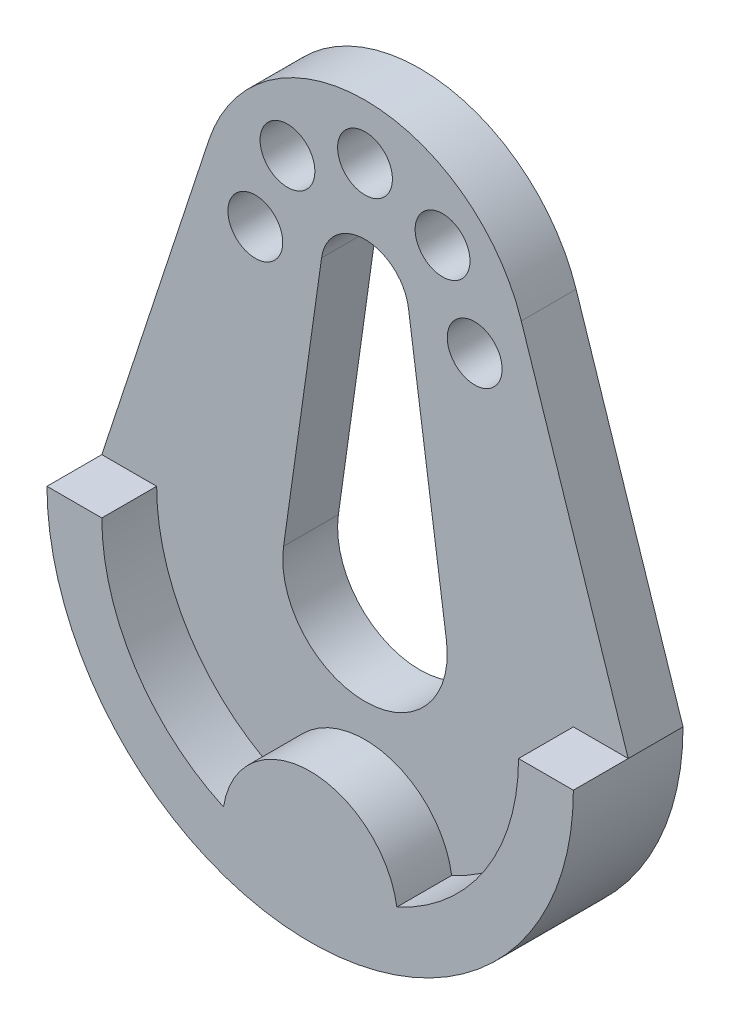
ISO-10303-21;
HEADER;
FILE_DESCRIPTION(('STEP AP214'),'2;1');
FILE_NAME('part.step','',(''),(''),'','','');
FILE_SCHEMA(('AUTOMOTIVE_DESIGN { 1 0 10303 214 1 1 1 1 }'));
ENDSEC;
DATA;
#1=APPLICATION_CONTEXT('core data for automotive mechanical design processes');
#2=APPLICATION_PROTOCOL_DEFINITION('international standard','automotive_design',2000,#1);
#3=PRODUCT_CONTEXT('',#1,'mechanical');
#4=PRODUCT('Part','Part','',(#3));
#5=PRODUCT_RELATED_PRODUCT_CATEGORY('part','',(#4));
#6=PRODUCT_DEFINITION_FORMATION('','',#4);
#7=PRODUCT_DEFINITION_CONTEXT('part definition',#1,'design');
#8=PRODUCT_DEFINITION('design','',#6,#7);
#9=PRODUCT_DEFINITION_SHAPE('','',#8);
#10=(LENGTH_UNIT() NAMED_UNIT(*) SI_UNIT(.MILLI.,.METRE.));
#11=(NAMED_UNIT(*) PLANE_ANGLE_UNIT() SI_UNIT($,.RADIAN.));
#12=(NAMED_UNIT(*) SI_UNIT($,.STERADIAN.) SOLID_ANGLE_UNIT());
#13=UNCERTAINTY_MEASURE_WITH_UNIT(LENGTH_MEASURE(1.E-05),#10,'distance_accuracy_value','');
#14=(GEOMETRIC_REPRESENTATION_CONTEXT(3) GLOBAL_UNCERTAINTY_ASSIGNED_CONTEXT((#13)) GLOBAL_UNIT_ASSIGNED_CONTEXT((#10,
#11,#12)) REPRESENTATION_CONTEXT('',''));
#15=CARTESIAN_POINT('',(0.,0.,0.));
#16=DIRECTION('',(0.,0.,1.));
#17=DIRECTION('',(1.,0.,0.));
#18=AXIS2_PLACEMENT_3D('',#15,#16,#17);
#19=CARTESIAN_POINT('',(43.3256929799226,14.2308675366532,10.));
#20=DIRECTION('',(-0.950062420974742,-0.312059924135753,0.));
#21=DIRECTION('',(0.312059924135753,-0.950062420974742,0.));
#22=AXIS2_PLACEMENT_3D('',#19,#20,#21);
#23=PLANE('',#22);
#24=DIRECTION('',(-0.312059924135753,0.950062420974742,0.));
#25=VECTOR('',#24,1.);
#26=CARTESIAN_POINT('',(43.3256929799226,14.2308675366532,0.));
#27=LINE('',#26,#25);
#28=CARTESIAN_POINT('',(48.,0.,0.));
#29=VERTEX_POINT('',#28);
#30=CARTESIAN_POINT('',(28.5018726292423,59.3617977240726,0.));
#31=VERTEX_POINT('',#30);
#32=EDGE_CURVE('E235',#29,#31,#27,.T.);
#33=ORIENTED_EDGE('',*,*,#32,.T.);
#34=DIRECTION('',(0.,0.,-1.));
#35=VECTOR('',#34,1.);
#36=CARTESIAN_POINT('',(28.5018726292423,59.3617977240726,10.));
#37=LINE('',#36,#35);
#38=CARTESIAN_POINT('',(28.5018726292423,59.3617977240726,10.));
#39=VERTEX_POINT('',#38);
#40=EDGE_CURVE('E47',#39,#31,#37,.T.);
#41=ORIENTED_EDGE('',*,*,#40,.F.);
#42=DIRECTION('',(-0.312059924135753,0.950062420974742,0.));
#43=VECTOR('',#42,1.);
#44=CARTESIAN_POINT('',(43.3256929799226,14.2308675366532,10.));
#45=LINE('',#44,#43);
#46=CARTESIAN_POINT('',(48.,0.,10.));
#47=VERTEX_POINT('',#46);
#48=EDGE_CURVE('E204',#47,#39,#45,.T.);
#49=ORIENTED_EDGE('',*,*,#48,.F.);
#50=DIRECTION('',(0.,0.,-1.));
#51=VECTOR('',#50,1.);
#52=CARTESIAN_POINT('',(48.,0.,10.));
#53=LINE('',#52,#51);
#54=EDGE_CURVE('E11',#47,#29,#53,.T.);
#55=ORIENTED_EDGE('',*,*,#54,.T.);
#56=EDGE_LOOP('',(#33,#41,#49,#55));
#57=FACE_BOUND('',#56,.T.);
#58=ADVANCED_FACE('F37',(#57),#23,.F.);
#59=CARTESIAN_POINT('',(0.,50.,10.));
#60=DIRECTION('',(0.,0.,-1.));
#61=DIRECTION('',(-1.,0.,0.));
#62=AXIS2_PLACEMENT_3D('',#59,#60,#61);
#63=CYLINDRICAL_SURFACE('',#62,30.);
#64=CARTESIAN_POINT('',(0.,50.,0.));
#65=DIRECTION('',(0.,0.,1.));
#66=DIRECTION('',(1.,0.,0.));
#67=AXIS2_PLACEMENT_3D('',#64,#65,#66);
#68=CIRCLE('',#67,30.);
#69=CARTESIAN_POINT('',(-28.5018726292423,59.3617977240726,0.));
#70=VERTEX_POINT('',#69);
#71=EDGE_CURVE('E83',#31,#70,#68,.T.);
#72=ORIENTED_EDGE('',*,*,#71,.T.);
#73=DIRECTION('',(0.,0.,-1.));
#74=VECTOR('',#73,1.);
#75=CARTESIAN_POINT('',(-28.5018726292423,59.3617977240726,10.));
#76=LINE('',#75,#74);
#77=CARTESIAN_POINT('',(-28.5018726292423,59.3617977240726,10.));
#78=VERTEX_POINT('',#77);
#79=EDGE_CURVE('E139',#78,#70,#76,.T.);
#80=ORIENTED_EDGE('',*,*,#79,.F.);
#81=CARTESIAN_POINT('',(0.,50.,10.));
#82=DIRECTION('',(0.,0.,1.));
#83=DIRECTION('',(1.,0.,0.));
#84=AXIS2_PLACEMENT_3D('',#81,#82,#83);
#85=CIRCLE('',#84,30.);
#86=EDGE_CURVE('E131',#39,#78,#85,.T.);
#87=ORIENTED_EDGE('',*,*,#86,.F.);
#88=ORIENTED_EDGE('',*,*,#40,.T.);
#89=EDGE_LOOP('',(#72,#80,#87,#88));
#90=FACE_BOUND('',#89,.T.);
#91=ADVANCED_FACE('F274',(#90),#63,.T.);
#92=CARTESIAN_POINT('',(-43.3256929799227,14.2308675366532,10.));
#93=DIRECTION('',(0.950062420974742,-0.312059924135752,0.));
#94=DIRECTION('',(0.312059924135752,0.950062420974742,0.));
#95=AXIS2_PLACEMENT_3D('',#92,#93,#94);
#96=PLANE('',#95);
#97=DIRECTION('',(-0.312059924135752,-0.950062420974742,0.));
#98=VECTOR('',#97,1.);
#99=CARTESIAN_POINT('',(-43.3256929799227,14.2308675366532,0.));
#100=LINE('',#99,#98);
#101=CARTESIAN_POINT('',(-48.,0.,0.));
#102=VERTEX_POINT('',#101);
#103=EDGE_CURVE('E90',#70,#102,#100,.T.);
#104=ORIENTED_EDGE('',*,*,#103,.T.);
#105=DIRECTION('',(0.,0.,-1.));
#106=VECTOR('',#105,1.);
#107=CARTESIAN_POINT('',(-48.,0.,10.));
#108=LINE('',#107,#106);
#109=CARTESIAN_POINT('',(-48.,0.,10.));
#110=VERTEX_POINT('',#109);
#111=EDGE_CURVE('E133',#110,#102,#108,.T.);
#112=ORIENTED_EDGE('',*,*,#111,.F.);
#113=DIRECTION('',(-0.312059924135752,-0.950062420974742,0.));
#114=VECTOR('',#113,1.);
#115=CARTESIAN_POINT('',(-43.3256929799227,14.2308675366532,10.));
#116=LINE('',#115,#114);
#117=EDGE_CURVE('E126',#78,#110,#116,.T.);
#118=ORIENTED_EDGE('',*,*,#117,.F.);
#119=ORIENTED_EDGE('',*,*,#79,.T.);
#120=EDGE_LOOP('',(#104,#112,#118,#119));
#121=FACE_BOUND('',#120,.T.);
#122=ADVANCED_FACE('F134',(#121),#96,.F.);
#123=CARTESIAN_POINT('',(0.,50.,10.));
#124=DIRECTION('',(0.,0.,-1.));
#125=DIRECTION('',(-1.,0.,0.));
#126=AXIS2_PLACEMENT_3D('',#123,#124,#125);
#127=CYLINDRICAL_SURFACE('',#126,8.);
#128=CARTESIAN_POINT('',(0.,50.,0.));
#129=DIRECTION('',(0.,0.,1.));
#130=DIRECTION('',(1.,0.,0.));
#131=AXIS2_PLACEMENT_3D('',#128,#129,#130);
#132=CIRCLE('',#131,8.);
#133=CARTESIAN_POINT('',(7.9212120284714,51.12,0.));
#134=VERTEX_POINT('',#133);
#135=CARTESIAN_POINT('',(-7.9212120284714,51.12,0.));
#136=VERTEX_POINT('',#135);
#137=EDGE_CURVE('E223',#134,#136,#132,.T.);
#138=ORIENTED_EDGE('',*,*,#137,.F.);
#139=DIRECTION('',(0.,0.,-1.));
#140=VECTOR('',#139,1.);
#141=CARTESIAN_POINT('',(7.9212120284714,51.12,10.));
#142=LINE('',#141,#140);
#143=CARTESIAN_POINT('',(7.9212120284714,51.12,10.));
#144=VERTEX_POINT('',#143);
#145=EDGE_CURVE('E41',#144,#134,#142,.T.);
#146=ORIENTED_EDGE('',*,*,#145,.F.);
#147=CARTESIAN_POINT('',(0.,50.,10.));
#148=DIRECTION('',(0.,0.,1.));
#149=DIRECTION('',(1.,0.,0.));
#150=AXIS2_PLACEMENT_3D('',#147,#148,#149);
#151=CIRCLE('',#150,8.);
#152=CARTESIAN_POINT('',(-7.9212120284714,51.12,10.));
#153=VERTEX_POINT('',#152);
#154=EDGE_CURVE('E187',#144,#153,#151,.T.);
#155=ORIENTED_EDGE('',*,*,#154,.T.);
#156=DIRECTION('',(0.,0.,-1.));
#157=VECTOR('',#156,1.);
#158=CARTESIAN_POINT('',(-7.9212120284714,51.12,10.));
#159=LINE('',#158,#157);
#160=EDGE_CURVE('E208',#153,#136,#159,.T.);
#161=ORIENTED_EDGE('',*,*,#160,.T.);
#162=EDGE_LOOP('',(#138,#146,#155,#161));
#163=FACE_BOUND('',#162,.T.);
#164=ADVANCED_FACE('F250',(#163),#127,.F.);
#165=CARTESIAN_POINT('',(14.8522725533839,2.1,10.));
#166=DIRECTION('',(-0.990151503558925,-0.14,0.));
#167=DIRECTION('',(0.14,-0.990151503558925,0.));
#168=AXIS2_PLACEMENT_3D('',#165,#166,#167);
#169=PLANE('',#168);
#170=DIRECTION('',(-0.14,0.990151503558925,0.));
#171=VECTOR('',#170,1.);
#172=CARTESIAN_POINT('',(14.8522725533839,2.1,0.));
#173=LINE('',#172,#171);
#174=CARTESIAN_POINT('',(14.8522725533839,2.1,0.));
#175=VERTEX_POINT('',#174);
#176=EDGE_CURVE('E226',#175,#134,#173,.T.);
#177=ORIENTED_EDGE('',*,*,#176,.F.);
#178=DIRECTION('',(0.,0.,-1.));
#179=VECTOR('',#178,1.);
#180=CARTESIAN_POINT('',(14.8522725533839,2.1,10.));
#181=LINE('',#180,#179);
#182=CARTESIAN_POINT('',(14.8522725533839,2.1,10.));
#183=VERTEX_POINT('',#182);
#184=EDGE_CURVE('E243',#183,#175,#181,.T.);
#185=ORIENTED_EDGE('',*,*,#184,.F.);
#186=DIRECTION('',(-0.14,0.990151503558925,0.));
#187=VECTOR('',#186,1.);
#188=CARTESIAN_POINT('',(14.8522725533839,2.1,10.));
#189=LINE('',#188,#187);
#190=EDGE_CURVE('E189',#183,#144,#189,.T.);
#191=ORIENTED_EDGE('',*,*,#190,.T.);
#192=ORIENTED_EDGE('',*,*,#145,.T.);
#193=EDGE_LOOP('',(#177,#185,#191,#192));
#194=FACE_BOUND('',#193,.T.);
#195=ADVANCED_FACE('F248',(#194),#169,.T.);
#196=CARTESIAN_POINT('',(0.,0.,10.));
#197=DIRECTION('',(0.,0.,-1.));
#198=DIRECTION('',(-1.,0.,0.));
#199=AXIS2_PLACEMENT_3D('',#196,#197,#198);
#200=CYLINDRICAL_SURFACE('',#199,15.);
#201=CARTESIAN_POINT('',(0.,0.,0.));
#202=DIRECTION('',(0.,0.,1.));
#203=DIRECTION('',(1.,0.,0.));
#204=AXIS2_PLACEMENT_3D('',#201,#202,#203);
#205=CIRCLE('',#204,15.);
#206=CARTESIAN_POINT('',(-14.8522725533839,2.1,0.));
#207=VERTEX_POINT('',#206);
#208=EDGE_CURVE('E229',#207,#175,#205,.T.);
#209=ORIENTED_EDGE('',*,*,#208,.F.);
#210=DIRECTION('',(0.,0.,-1.));
#211=VECTOR('',#210,1.);
#212=CARTESIAN_POINT('',(-14.8522725533839,2.1,10.));
#213=LINE('',#212,#211);
#214=CARTESIAN_POINT('',(-14.8522725533839,2.1,10.));
#215=VERTEX_POINT('',#214);
#216=EDGE_CURVE('E242',#215,#207,#213,.T.);
#217=ORIENTED_EDGE('',*,*,#216,.F.);
#218=CARTESIAN_POINT('',(0.,0.,10.));
#219=DIRECTION('',(0.,0.,1.));
#220=DIRECTION('',(1.,0.,0.));
#221=AXIS2_PLACEMENT_3D('',#218,#219,#220);
#222=CIRCLE('',#221,15.);
#223=EDGE_CURVE('E192',#215,#183,#222,.T.);
#224=ORIENTED_EDGE('',*,*,#223,.T.);
#225=ORIENTED_EDGE('',*,*,#184,.T.);
#226=EDGE_LOOP('',(#209,#217,#224,#225));
#227=FACE_BOUND('',#226,.T.);
#228=ADVANCED_FACE('F255',(#227),#200,.F.);
#229=CARTESIAN_POINT('',(-14.8522725533839,2.1,10.));
#230=DIRECTION('',(0.990151503558925,-0.14,0.));
#231=DIRECTION('',(0.14,0.990151503558925,0.));
#232=AXIS2_PLACEMENT_3D('',#229,#230,#231);
#233=PLANE('',#232);
#234=DIRECTION('',(-0.14,-0.990151503558925,0.));
#235=VECTOR('',#234,1.);
#236=CARTESIAN_POINT('',(-14.8522725533839,2.1,0.));
#237=LINE('',#236,#235);
#238=EDGE_CURVE('E232',#136,#207,#237,.T.);
#239=ORIENTED_EDGE('',*,*,#238,.F.);
#240=ORIENTED_EDGE('',*,*,#160,.F.);
#241=DIRECTION('',(-0.14,-0.990151503558925,0.));
#242=VECTOR('',#241,1.);
#243=CARTESIAN_POINT('',(-14.8522725533839,2.1,10.));
#244=LINE('',#243,#242);
#245=EDGE_CURVE('E195',#153,#215,#244,.T.);
#246=ORIENTED_EDGE('',*,*,#245,.T.);
#247=ORIENTED_EDGE('',*,*,#216,.T.);
#248=EDGE_LOOP('',(#239,#240,#246,#247));
#249=FACE_BOUND('',#248,.T.);
#250=ADVANCED_FACE('F260',(#249),#233,.T.);
#251=CARTESIAN_POINT('',(-20.,50.,10.));
#252=DIRECTION('',(0.,0.,-1.));
#253=DIRECTION('',(-1.,0.,0.));
#254=AXIS2_PLACEMENT_3D('',#251,#252,#253);
#255=CYLINDRICAL_SURFACE('',#254,5.);
#256=CARTESIAN_POINT('',(-20.,50.,10.));
#257=DIRECTION('',(0.,0.,1.));
#258=DIRECTION('',(1.,0.,0.));
#259=AXIS2_PLACEMENT_3D('',#256,#257,#258);
#260=CIRCLE('',#259,5.);
#261=CARTESIAN_POINT('',(-15.,50.,10.));
#262=VERTEX_POINT('',#261);
#263=EDGE_CURVE('E184',#262,#262,#260,.T.);
#264=ORIENTED_EDGE('',*,*,#263,.T.);
#265=EDGE_LOOP('',(#264));
#266=FACE_BOUND('',#265,.T.);
#267=CARTESIAN_POINT('',(-20.,50.,0.));
#268=DIRECTION('',(0.,0.,1.));
#269=DIRECTION('',(1.,0.,0.));
#270=AXIS2_PLACEMENT_3D('',#267,#268,#269);
#271=CIRCLE('',#270,5.);
#272=CARTESIAN_POINT('',(-15.,50.,0.));
#273=VERTEX_POINT('',#272);
#274=EDGE_CURVE('E220',#273,#273,#271,.T.);
#275=ORIENTED_EDGE('',*,*,#274,.F.);
#276=EDGE_LOOP('',(#275));
#277=FACE_BOUND('',#276,.T.);
#278=ADVANCED_FACE('F262',(#266,#277),#255,.F.);
#279=CARTESIAN_POINT('',(-14.1421356237309,64.142135623731,10.));
#280=DIRECTION('',(0.,0.,-1.));
#281=DIRECTION('',(-1.,0.,0.));
#282=AXIS2_PLACEMENT_3D('',#279,#280,#281);
#283=CYLINDRICAL_SURFACE('',#282,5.);
#284=CARTESIAN_POINT('',(-14.1421356237309,64.142135623731,10.));
#285=DIRECTION('',(0.,0.,1.));
#286=DIRECTION('',(1.,0.,0.));
#287=AXIS2_PLACEMENT_3D('',#284,#285,#286);
#288=CIRCLE('',#287,5.);
#289=CARTESIAN_POINT('',(-9.14213562373093,64.142135623731,10.));
#290=VERTEX_POINT('',#289);
#291=EDGE_CURVE('E181',#290,#290,#288,.T.);
#292=ORIENTED_EDGE('',*,*,#291,.T.);
#293=EDGE_LOOP('',(#292));
#294=FACE_BOUND('',#293,.T.);
#295=CARTESIAN_POINT('',(-14.1421356237309,64.142135623731,0.));
#296=DIRECTION('',(0.,0.,1.));
#297=DIRECTION('',(1.,0.,0.));
#298=AXIS2_PLACEMENT_3D('',#295,#296,#297);
#299=CIRCLE('',#298,5.);
#300=CARTESIAN_POINT('',(-9.14213562373093,64.142135623731,0.));
#301=VERTEX_POINT('',#300);
#302=EDGE_CURVE('E217',#301,#301,#299,.T.);
#303=ORIENTED_EDGE('',*,*,#302,.F.);
#304=EDGE_LOOP('',(#303));
#305=FACE_BOUND('',#304,.T.);
#306=ADVANCED_FACE('F268',(#294,#305),#283,.F.);
#307=CARTESIAN_POINT('',(0.,70.,10.));
#308=DIRECTION('',(0.,0.,-1.));
#309=DIRECTION('',(-1.,0.,0.));
#310=AXIS2_PLACEMENT_3D('',#307,#308,#309);
#311=CYLINDRICAL_SURFACE('',#310,5.);
#312=CARTESIAN_POINT('',(0.,70.,10.));
#313=DIRECTION('',(0.,0.,1.));
#314=DIRECTION('',(1.,0.,0.));
#315=AXIS2_PLACEMENT_3D('',#312,#313,#314);
#316=CIRCLE('',#315,5.);
#317=CARTESIAN_POINT('',(5.00000000000007,70.,10.));
#318=VERTEX_POINT('',#317);
#319=EDGE_CURVE('E178',#318,#318,#316,.T.);
#320=ORIENTED_EDGE('',*,*,#319,.T.);
#321=EDGE_LOOP('',(#320));
#322=FACE_BOUND('',#321,.T.);
#323=CARTESIAN_POINT('',(0.,70.,0.));
#324=DIRECTION('',(0.,0.,1.));
#325=DIRECTION('',(1.,0.,0.));
#326=AXIS2_PLACEMENT_3D('',#323,#324,#325);
#327=CIRCLE('',#326,5.);
#328=CARTESIAN_POINT('',(5.00000000000007,70.,0.));
#329=VERTEX_POINT('',#328);
#330=EDGE_CURVE('E214',#329,#329,#327,.T.);
#331=ORIENTED_EDGE('',*,*,#330,.F.);
#332=EDGE_LOOP('',(#331));
#333=FACE_BOUND('',#332,.T.);
#334=ADVANCED_FACE('F400',(#322,#333),#311,.F.);
#335=CARTESIAN_POINT('',(14.142135623731,64.1421356237309,10.));
#336=DIRECTION('',(0.,0.,-1.));
#337=DIRECTION('',(-1.,0.,0.));
#338=AXIS2_PLACEMENT_3D('',#335,#336,#337);
#339=CYLINDRICAL_SURFACE('',#338,4.99999999999999);
#340=CARTESIAN_POINT('',(14.142135623731,64.1421356237309,10.));
#341=DIRECTION('',(0.,0.,1.));
#342=DIRECTION('',(1.,0.,0.));
#343=AXIS2_PLACEMENT_3D('',#340,#341,#342);
#344=CIRCLE('',#343,4.99999999999999);
#345=CARTESIAN_POINT('',(19.142135623731,64.1421356237309,10.));
#346=VERTEX_POINT('',#345);
#347=EDGE_CURVE('E175',#346,#346,#344,.T.);
#348=ORIENTED_EDGE('',*,*,#347,.T.);
#349=EDGE_LOOP('',(#348));
#350=FACE_BOUND('',#349,.T.);
#351=CARTESIAN_POINT('',(14.142135623731,64.1421356237309,0.));
#352=DIRECTION('',(0.,0.,1.));
#353=DIRECTION('',(1.,0.,0.));
#354=AXIS2_PLACEMENT_3D('',#351,#352,#353);
#355=CIRCLE('',#354,4.99999999999999);
#356=CARTESIAN_POINT('',(19.142135623731,64.1421356237309,0.));
#357=VERTEX_POINT('',#356);
#358=EDGE_CURVE('E211',#357,#357,#355,.T.);
#359=ORIENTED_EDGE('',*,*,#358,.F.);
#360=EDGE_LOOP('',(#359));
#361=FACE_BOUND('',#360,.T.);
#362=ADVANCED_FACE('F393',(#350,#361),#339,.F.);
#363=CARTESIAN_POINT('',(20.,49.9999999999999,10.));
#364=DIRECTION('',(0.,0.,-1.));
#365=DIRECTION('',(-1.,0.,0.));
#366=AXIS2_PLACEMENT_3D('',#363,#364,#365);
#367=CYLINDRICAL_SURFACE('',#366,5.);
#368=CARTESIAN_POINT('',(20.,49.9999999999999,10.));
#369=DIRECTION('',(0.,0.,1.));
#370=DIRECTION('',(1.,0.,0.));
#371=AXIS2_PLACEMENT_3D('',#368,#369,#370);
#372=CIRCLE('',#371,5.);
#373=CARTESIAN_POINT('',(25.,49.9999999999999,10.));
#374=VERTEX_POINT('',#373);
#375=EDGE_CURVE('E172',#374,#374,#372,.T.);
#376=ORIENTED_EDGE('',*,*,#375,.T.);
#377=EDGE_LOOP('',(#376));
#378=FACE_BOUND('',#377,.T.);
#379=CARTESIAN_POINT('',(20.,49.9999999999999,0.));
#380=DIRECTION('',(0.,0.,1.));
#381=DIRECTION('',(1.,0.,0.));
#382=AXIS2_PLACEMENT_3D('',#379,#380,#381);
#383=CIRCLE('',#382,5.);
#384=CARTESIAN_POINT('',(25.,49.9999999999999,0.));
#385=VERTEX_POINT('',#384);
#386=EDGE_CURVE('E171',#385,#385,#383,.T.);
#387=ORIENTED_EDGE('',*,*,#386,.F.);
#388=EDGE_LOOP('',(#387));
#389=FACE_BOUND('',#388,.T.);
#390=ADVANCED_FACE('F39',(#378,#389),#367,.F.);
#391=CARTESIAN_POINT('',(0.,0.,10.));
#392=DIRECTION('',(0.,0.,1.));
#393=DIRECTION('',(1.,0.,0.));
#394=AXIS2_PLACEMENT_3D('',#391,#392,#393);
#395=PLANE('',#394);
#396=ORIENTED_EDGE('',*,*,#375,.F.);
#397=EDGE_LOOP('',(#396));
#398=FACE_BOUND('',#397,.T.);
#399=ORIENTED_EDGE('',*,*,#347,.F.);
#400=EDGE_LOOP('',(#399));
#401=FACE_BOUND('',#400,.T.);
#402=ORIENTED_EDGE('',*,*,#319,.F.);
#403=EDGE_LOOP('',(#402));
#404=FACE_BOUND('',#403,.T.);
#405=ORIENTED_EDGE('',*,*,#291,.F.);
#406=EDGE_LOOP('',(#405));
#407=FACE_BOUND('',#406,.T.);
#408=ORIENTED_EDGE('',*,*,#263,.F.);
#409=EDGE_LOOP('',(#408));
#410=FACE_BOUND('',#409,.T.);
#411=ORIENTED_EDGE('',*,*,#154,.F.);
#412=ORIENTED_EDGE('',*,*,#190,.F.);
#413=ORIENTED_EDGE('',*,*,#223,.F.);
#414=ORIENTED_EDGE('',*,*,#245,.F.);
#415=EDGE_LOOP('',(#411,#412,#413,#414));
#416=FACE_BOUND('',#415,.T.);
#417=CARTESIAN_POINT('',(0.,-37.,10.));
#418=DIRECTION('',(0.,0.,1.));
#419=DIRECTION('',(1.,0.,0.));
#420=AXIS2_PLACEMENT_3D('',#417,#418,#419);
#421=CIRCLE('',#420,16.);
#422=CARTESIAN_POINT('',(-15.8119368968356,-34.554054054054,10.));
#423=VERTEX_POINT('',#422);
#424=CARTESIAN_POINT('',(15.8119368968356,-34.5540540540541,10.));
#425=VERTEX_POINT('',#424);
#426=EDGE_CURVE('E198',#423,#425,#421,.F.);
#427=ORIENTED_EDGE('',*,*,#426,.T.);
#428=CARTESIAN_POINT('',(0.,0.,10.));
#429=DIRECTION('',(0.,0.,1.));
#430=DIRECTION('',(1.,0.,0.));
#431=AXIS2_PLACEMENT_3D('',#428,#429,#430);
#432=CIRCLE('',#431,38.);
#433=CARTESIAN_POINT('',(38.,0.,10.));
#434=VERTEX_POINT('',#433);
#435=EDGE_CURVE('E200',#425,#434,#432,.T.);
#436=ORIENTED_EDGE('',*,*,#435,.T.);
#437=DIRECTION('',(1.,0.,0.));
#438=VECTOR('',#437,1.);
#439=CARTESIAN_POINT('',(0.,0.,10.));
#440=LINE('',#439,#438);
#441=EDGE_CURVE('E202',#434,#47,#440,.T.);
#442=ORIENTED_EDGE('',*,*,#441,.T.);
#443=ORIENTED_EDGE('',*,*,#48,.T.);
#444=ORIENTED_EDGE('',*,*,#86,.T.);
#445=ORIENTED_EDGE('',*,*,#117,.T.);
#446=DIRECTION('',(1.,0.,0.));
#447=VECTOR('',#446,1.);
#448=CARTESIAN_POINT('',(0.,0.,10.));
#449=LINE('',#448,#447);
#450=CARTESIAN_POINT('',(-38.,0.,10.));
#451=VERTEX_POINT('',#450);
#452=EDGE_CURVE('E129',#110,#451,#449,.T.);
#453=ORIENTED_EDGE('',*,*,#452,.T.);
#454=CARTESIAN_POINT('',(0.,0.,10.));
#455=DIRECTION('',(0.,0.,1.));
#456=DIRECTION('',(1.,0.,0.));
#457=AXIS2_PLACEMENT_3D('',#454,#455,#456);
#458=CIRCLE('',#457,38.);
#459=EDGE_CURVE('E56',#451,#423,#458,.T.);
#460=ORIENTED_EDGE('',*,*,#459,.T.);
#461=EDGE_LOOP('',(#427,#436,#442,#443,#444,#445,#453,#460));
#462=FACE_BOUND('',#461,.T.);
#463=ADVANCED_FACE('F127',(#398,#401,#404,#407,#410,#416,#462),#395,.T.);
#464=CARTESIAN_POINT('',(0.,0.,0.));
#465=DIRECTION('',(0.,0.,1.));
#466=DIRECTION('',(1.,0.,0.));
#467=AXIS2_PLACEMENT_3D('',#464,#465,#466);
#468=PLANE('',#467);
#469=ORIENTED_EDGE('',*,*,#386,.T.);
#470=EDGE_LOOP('',(#469));
#471=FACE_BOUND('',#470,.T.);
#472=ORIENTED_EDGE('',*,*,#358,.T.);
#473=EDGE_LOOP('',(#472));
#474=FACE_BOUND('',#473,.T.);
#475=ORIENTED_EDGE('',*,*,#330,.T.);
#476=EDGE_LOOP('',(#475));
#477=FACE_BOUND('',#476,.T.);
#478=ORIENTED_EDGE('',*,*,#302,.T.);
#479=EDGE_LOOP('',(#478));
#480=FACE_BOUND('',#479,.T.);
#481=ORIENTED_EDGE('',*,*,#274,.T.);
#482=EDGE_LOOP('',(#481));
#483=FACE_BOUND('',#482,.T.);
#484=ORIENTED_EDGE('',*,*,#137,.T.);
#485=ORIENTED_EDGE('',*,*,#238,.T.);
#486=ORIENTED_EDGE('',*,*,#208,.T.);
#487=ORIENTED_EDGE('',*,*,#176,.T.);
#488=EDGE_LOOP('',(#484,#485,#486,#487));
#489=FACE_BOUND('',#488,.T.);
#490=CARTESIAN_POINT('',(0.,0.,0.));
#491=DIRECTION('',(0.,0.,1.));
#492=DIRECTION('',(1.,0.,0.));
#493=AXIS2_PLACEMENT_3D('',#490,#491,#492);
#494=CIRCLE('',#493,48.);
#495=EDGE_CURVE('E330',#102,#29,#494,.T.);
#496=ORIENTED_EDGE('',*,*,#495,.F.);
#497=ORIENTED_EDGE('',*,*,#103,.F.);
#498=ORIENTED_EDGE('',*,*,#71,.F.);
#499=ORIENTED_EDGE('',*,*,#32,.F.);
#500=EDGE_LOOP('',(#496,#497,#498,#499));
#501=FACE_BOUND('',#500,.T.);
#502=ADVANCED_FACE('F253',(#471,#474,#477,#480,#483,#489,#501),#468,.F.);
#503=CARTESIAN_POINT('',(0.,0.,20.));
#504=DIRECTION('',(0.,0.,-1.));
#505=DIRECTION('',(-1.,0.,0.));
#506=AXIS2_PLACEMENT_3D('',#503,#504,#505);
#507=CYLINDRICAL_SURFACE('',#506,38.);
#508=DIRECTION('',(0.,0.,-1.));
#509=VECTOR('',#508,1.);
#510=CARTESIAN_POINT('',(38.,0.,20.));
#511=LINE('',#510,#509);
#512=CARTESIAN_POINT('',(38.,0.,20.));
#513=VERTEX_POINT('',#512);
#514=EDGE_CURVE('E162',#513,#434,#511,.T.);
#515=ORIENTED_EDGE('',*,*,#514,.T.);
#516=ORIENTED_EDGE('',*,*,#435,.F.);
#517=DIRECTION('',(0.,0.,-1.));
#518=VECTOR('',#517,1.);
#519=CARTESIAN_POINT('',(15.8119368968356,-34.5540540540541,20.));
#520=LINE('',#519,#518);
#521=CARTESIAN_POINT('',(15.8119368968356,-34.5540540540541,20.));
#522=VERTEX_POINT('',#521);
#523=EDGE_CURVE('E168',#522,#425,#520,.T.);
#524=ORIENTED_EDGE('',*,*,#523,.F.);
#525=CARTESIAN_POINT('',(0.,0.,20.));
#526=DIRECTION('',(0.,0.,1.));
#527=DIRECTION('',(1.,0.,0.));
#528=AXIS2_PLACEMENT_3D('',#525,#526,#527);
#529=CIRCLE('',#528,38.);
#530=EDGE_CURVE('E319',#522,#513,#529,.T.);
#531=ORIENTED_EDGE('',*,*,#530,.T.);
#532=EDGE_LOOP('',(#515,#516,#524,#531));
#533=FACE_BOUND('',#532,.T.);
#534=ADVANCED_FACE('F285',(#533),#507,.F.);
#535=CARTESIAN_POINT('',(0.,-37.,20.));
#536=DIRECTION('',(0.,0.,-1.));
#537=DIRECTION('',(-1.,0.,0.));
#538=AXIS2_PLACEMENT_3D('',#535,#536,#537);
#539=CYLINDRICAL_SURFACE('',#538,16.);
#540=ORIENTED_EDGE('',*,*,#523,.T.);
#541=ORIENTED_EDGE('',*,*,#426,.F.);
#542=DIRECTION('',(0.,0.,-1.));
#543=VECTOR('',#542,1.);
#544=CARTESIAN_POINT('',(-15.8119368968356,-34.554054054054,20.));
#545=LINE('',#544,#543);
#546=CARTESIAN_POINT('',(-15.8119368968356,-34.554054054054,20.));
#547=VERTEX_POINT('',#546);
#548=EDGE_CURVE('E159',#547,#423,#545,.T.);
#549=ORIENTED_EDGE('',*,*,#548,.F.);
#550=CARTESIAN_POINT('',(0.,-37.,20.));
#551=DIRECTION('',(0.,0.,1.));
#552=DIRECTION('',(1.,0.,0.));
#553=AXIS2_PLACEMENT_3D('',#550,#551,#552);
#554=CIRCLE('',#553,16.);
#555=EDGE_CURVE('E323',#547,#522,#554,.F.);
#556=ORIENTED_EDGE('',*,*,#555,.T.);
#557=EDGE_LOOP('',(#540,#541,#549,#556));
#558=FACE_BOUND('',#557,.T.);
#559=ADVANCED_FACE('F292',(#558),#539,.T.);
#560=CARTESIAN_POINT('',(0.,0.,20.));
#561=DIRECTION('',(0.,0.,-1.));
#562=DIRECTION('',(-1.,0.,0.));
#563=AXIS2_PLACEMENT_3D('',#560,#561,#562);
#564=CYLINDRICAL_SURFACE('',#563,38.);
#565=ORIENTED_EDGE('',*,*,#548,.T.);
#566=ORIENTED_EDGE('',*,*,#459,.F.);
#567=DIRECTION('',(0.,0.,-1.));
#568=VECTOR('',#567,1.);
#569=CARTESIAN_POINT('',(-38.,0.,20.));
#570=LINE('',#569,#568);
#571=CARTESIAN_POINT('',(-38.,0.,20.));
#572=VERTEX_POINT('',#571);
#573=EDGE_CURVE('E150',#572,#451,#570,.T.);
#574=ORIENTED_EDGE('',*,*,#573,.F.);
#575=CARTESIAN_POINT('',(0.,0.,20.));
#576=DIRECTION('',(0.,0.,1.));
#577=DIRECTION('',(1.,0.,0.));
#578=AXIS2_PLACEMENT_3D('',#575,#576,#577);
#579=CIRCLE('',#578,38.);
#580=EDGE_CURVE('E333',#572,#547,#579,.T.);
#581=ORIENTED_EDGE('',*,*,#580,.T.);
#582=EDGE_LOOP('',(#565,#566,#574,#581));
#583=FACE_BOUND('',#582,.T.);
#584=ADVANCED_FACE('F296',(#583),#564,.F.);
#585=CARTESIAN_POINT('',(0.,0.,20.));
#586=DIRECTION('',(0.,1.,0.));
#587=DIRECTION('',(0.,0.,1.));
#588=AXIS2_PLACEMENT_3D('',#585,#586,#587);
#589=PLANE('',#588);
#590=ORIENTED_EDGE('',*,*,#573,.T.);
#591=ORIENTED_EDGE('',*,*,#452,.F.);
#592=DIRECTION('',(0.,0.,-1.));
#593=VECTOR('',#592,1.);
#594=CARTESIAN_POINT('',(-48.,0.,20.));
#595=LINE('',#594,#593);
#596=CARTESIAN_POINT('',(-48.,0.,20.));
#597=VERTEX_POINT('',#596);
#598=EDGE_CURVE('E147',#597,#110,#595,.T.);
#599=ORIENTED_EDGE('',*,*,#598,.F.);
#600=DIRECTION('',(1.,0.,0.));
#601=VECTOR('',#600,1.);
#602=CARTESIAN_POINT('',(0.,0.,20.));
#603=LINE('',#602,#601);
#604=EDGE_CURVE('E335',#597,#572,#603,.T.);
#605=ORIENTED_EDGE('',*,*,#604,.T.);
#606=EDGE_LOOP('',(#590,#591,#599,#605));
#607=FACE_BOUND('',#606,.T.);
#608=ADVANCED_FACE('F144',(#607),#589,.T.);
#609=CARTESIAN_POINT('',(0.,0.,20.));
#610=DIRECTION('',(0.,0.,-1.));
#611=DIRECTION('',(-1.,0.,0.));
#612=AXIS2_PLACEMENT_3D('',#609,#610,#611);
#613=CYLINDRICAL_SURFACE('',#612,48.);
#614=ORIENTED_EDGE('',*,*,#495,.T.);
#615=ORIENTED_EDGE('',*,*,#54,.F.);
#616=DIRECTION('',(0.,0.,-1.));
#617=VECTOR('',#616,1.);
#618=CARTESIAN_POINT('',(48.,0.,20.));
#619=LINE('',#618,#617);
#620=CARTESIAN_POINT('',(48.,0.,20.));
#621=VERTEX_POINT('',#620);
#622=EDGE_CURVE('E157',#621,#47,#619,.T.);
#623=ORIENTED_EDGE('',*,*,#622,.F.);
#624=CARTESIAN_POINT('',(0.,0.,20.));
#625=DIRECTION('',(0.,0.,1.));
#626=DIRECTION('',(1.,0.,0.));
#627=AXIS2_PLACEMENT_3D('',#624,#625,#626);
#628=CIRCLE('',#627,48.);
#629=EDGE_CURVE('E155',#597,#621,#628,.T.);
#630=ORIENTED_EDGE('',*,*,#629,.F.);
#631=ORIENTED_EDGE('',*,*,#598,.T.);
#632=ORIENTED_EDGE('',*,*,#111,.T.);
#633=EDGE_LOOP('',(#614,#615,#623,#630,#631,#632));
#634=FACE_BOUND('',#633,.T.);
#635=ADVANCED_FACE('F152',(#634),#613,.T.);
#636=CARTESIAN_POINT('',(0.,0.,20.));
#637=DIRECTION('',(0.,1.,0.));
#638=DIRECTION('',(0.,0.,1.));
#639=AXIS2_PLACEMENT_3D('',#636,#637,#638);
#640=PLANE('',#639);
#641=ORIENTED_EDGE('',*,*,#622,.T.);
#642=ORIENTED_EDGE('',*,*,#441,.F.);
#643=ORIENTED_EDGE('',*,*,#514,.F.);
#644=DIRECTION('',(1.,0.,0.));
#645=VECTOR('',#644,1.);
#646=CARTESIAN_POINT('',(0.,0.,20.));
#647=LINE('',#646,#645);
#648=EDGE_CURVE('E326',#513,#621,#647,.T.);
#649=ORIENTED_EDGE('',*,*,#648,.T.);
#650=EDGE_LOOP('',(#641,#642,#643,#649));
#651=FACE_BOUND('',#650,.T.);
#652=ADVANCED_FACE('F305',(#651),#640,.T.);
#653=CARTESIAN_POINT('',(0.,0.,20.));
#654=DIRECTION('',(0.,0.,1.));
#655=DIRECTION('',(1.,0.,0.));
#656=AXIS2_PLACEMENT_3D('',#653,#654,#655);
#657=PLANE('',#656);
#658=ORIENTED_EDGE('',*,*,#530,.F.);
#659=ORIENTED_EDGE('',*,*,#555,.F.);
#660=ORIENTED_EDGE('',*,*,#580,.F.);
#661=ORIENTED_EDGE('',*,*,#604,.F.);
#662=ORIENTED_EDGE('',*,*,#629,.T.);
#663=ORIENTED_EDGE('',*,*,#648,.F.);
#664=EDGE_LOOP('',(#658,#659,#660,#661,#662,#663));
#665=FACE_BOUND('',#664,.T.);
#666=ADVANCED_FACE('F308',(#665),#657,.T.);
#667=CLOSED_SHELL('',(#58,#91,#122,#164,#195,#228,#250,#278,#306,#334,#362,#390,#463,#502,#534,
#559,#584,#608,#635,#652,#666));
#668=MANIFOLD_SOLID_BREP('B2',#667);
#669=ADVANCED_BREP_SHAPE_REPRESENTATION('',(#18,#668),#14);
#670=SHAPE_DEFINITION_REPRESENTATION(#9,#669);
ENDSEC;
END-ISO-10303-21;
